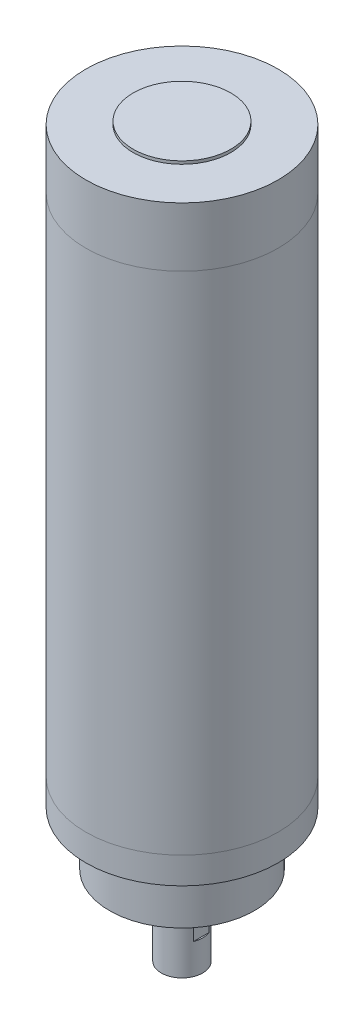
ISO-10303-21;
HEADER;
FILE_DESCRIPTION(('STEP AP214'),'2;1');
FILE_NAME('part.step','',(''),(''),'','','');
FILE_SCHEMA(('AUTOMOTIVE_DESIGN { 1 0 10303 214 1 1 1 1 }'));
ENDSEC;
DATA;
#1=APPLICATION_CONTEXT('core data for automotive mechanical design processes');
#2=APPLICATION_PROTOCOL_DEFINITION('international standard','automotive_design',2000,#1);
#3=PRODUCT_CONTEXT('',#1,'mechanical');
#4=PRODUCT('Part','Part','',(#3));
#5=PRODUCT_RELATED_PRODUCT_CATEGORY('part','',(#4));
#6=PRODUCT_DEFINITION_FORMATION('','',#4);
#7=PRODUCT_DEFINITION_CONTEXT('part definition',#1,'design');
#8=PRODUCT_DEFINITION('design','',#6,#7);
#9=PRODUCT_DEFINITION_SHAPE('','',#8);
#10=(LENGTH_UNIT() NAMED_UNIT(*) SI_UNIT(.MILLI.,.METRE.));
#11=(NAMED_UNIT(*) PLANE_ANGLE_UNIT() SI_UNIT($,.RADIAN.));
#12=(NAMED_UNIT(*) SI_UNIT($,.STERADIAN.) SOLID_ANGLE_UNIT());
#13=UNCERTAINTY_MEASURE_WITH_UNIT(LENGTH_MEASURE(1.E-05),#10,'distance_accuracy_value','');
#14=(GEOMETRIC_REPRESENTATION_CONTEXT(3) GLOBAL_UNCERTAINTY_ASSIGNED_CONTEXT((#13)) GLOBAL_UNIT_ASSIGNED_CONTEXT((#10,
#11,#12)) REPRESENTATION_CONTEXT('',''));
#15=CARTESIAN_POINT('',(0.,0.,0.));
#16=DIRECTION('',(0.,0.,1.));
#17=DIRECTION('',(1.,0.,0.));
#18=AXIS2_PLACEMENT_3D('',#15,#16,#17);
#19=CARTESIAN_POINT('',(0.,-40.5,0.));
#20=DIRECTION('',(0.,-1.,0.));
#21=DIRECTION('',(1.,0.,0.));
#22=AXIS2_PLACEMENT_3D('',#19,#20,#21);
#23=CYLINDRICAL_SURFACE('',#22,7.);
#24=CARTESIAN_POINT('',(0.,-43.7,0.));
#25=DIRECTION('',(0.,-1.,0.));
#26=DIRECTION('',(0.,0.,-1.));
#27=AXIS2_PLACEMENT_3D('',#24,#25,#26);
#28=CIRCLE('',#27,7.);
#29=CARTESIAN_POINT('',(6.50000000000001,-43.7,2.5980762113533));
#30=VERTEX_POINT('',#29);
#31=CARTESIAN_POINT('',(6.50000000000001,-43.7,-2.5980762113533));
#32=VERTEX_POINT('',#31);
#33=EDGE_CURVE('E65',#30,#32,#28,.F.);
#34=ORIENTED_EDGE('',*,*,#33,.F.);
#35=DIRECTION('',(0.,-1.,0.));
#36=VECTOR('',#35,1.);
#37=CARTESIAN_POINT('',(6.50000000000001,-40.5,2.5980762113533));
#38=LINE('',#37,#36);
#39=CARTESIAN_POINT('',(6.5,-35.5,2.5980762113533));
#40=VERTEX_POINT('',#39);
#41=EDGE_CURVE('E154',#40,#30,#38,.T.);
#42=ORIENTED_EDGE('',*,*,#41,.F.);
#43=CARTESIAN_POINT('',(0.,-35.5,0.));
#44=DIRECTION('',(0.,1.,0.));
#45=DIRECTION('',(0.,0.,1.));
#46=AXIS2_PLACEMENT_3D('',#43,#44,#45);
#47=CIRCLE('',#46,7.);
#48=CARTESIAN_POINT('',(6.5,-35.5,-2.5980762113533));
#49=VERTEX_POINT('',#48);
#50=EDGE_CURVE('E146',#49,#40,#47,.F.);
#51=ORIENTED_EDGE('',*,*,#50,.F.);
#52=DIRECTION('',(0.,-1.,0.));
#53=VECTOR('',#52,1.);
#54=CARTESIAN_POINT('',(6.50000000000001,-40.5,-2.5980762113533));
#55=LINE('',#54,#53);
#56=EDGE_CURVE('E156',#32,#49,#55,.F.);
#57=ORIENTED_EDGE('',*,*,#56,.F.);
#58=EDGE_LOOP('',(#34,#42,#51,#57));
#59=FACE_BOUND('',#58,.T.);
#60=CARTESIAN_POINT('',(0.,-32.,0.));
#61=DIRECTION('',(0.,-1.,0.));
#62=DIRECTION('',(1.,0.,0.));
#63=AXIS2_PLACEMENT_3D('',#60,#61,#62);
#64=CIRCLE('',#63,7.);
#65=CARTESIAN_POINT('',(7.,-32.,0.));
#66=VERTEX_POINT('',#65);
#67=EDGE_CURVE('E144',#66,#66,#64,.T.);
#68=ORIENTED_EDGE('',*,*,#67,.T.);
#69=EDGE_LOOP('',(#68));
#70=FACE_BOUND('',#69,.T.);
#71=CARTESIAN_POINT('',(0.,-54.,0.));
#72=DIRECTION('',(0.,-1.,0.));
#73=DIRECTION('',(1.,0.,0.));
#74=AXIS2_PLACEMENT_3D('',#71,#72,#73);
#75=CIRCLE('',#74,7.);
#76=CARTESIAN_POINT('',(7.,-54.,0.));
#77=VERTEX_POINT('',#76);
#78=EDGE_CURVE('E149',#77,#77,#75,.T.);
#79=ORIENTED_EDGE('',*,*,#78,.F.);
#80=EDGE_LOOP('',(#79));
#81=FACE_BOUND('',#80,.T.);
#82=DIRECTION('',(0.,-1.,0.));
#83=VECTOR('',#82,1.);
#84=CARTESIAN_POINT('',(-6.50000000000001,-40.5,-2.5980762113533));
#85=LINE('',#84,#83);
#86=CARTESIAN_POINT('',(-6.50000000000001,-43.7,-2.5980762113533));
#87=VERTEX_POINT('',#86);
#88=CARTESIAN_POINT('',(-6.5,-35.5,-2.5980762113533));
#89=VERTEX_POINT('',#88);
#90=EDGE_CURVE('E94',#87,#89,#85,.F.);
#91=ORIENTED_EDGE('',*,*,#90,.T.);
#92=CARTESIAN_POINT('',(0.,-35.5,0.));
#93=DIRECTION('',(0.,-1.,0.));
#94=DIRECTION('',(0.,0.,-1.));
#95=AXIS2_PLACEMENT_3D('',#92,#93,#94);
#96=CIRCLE('',#95,7.);
#97=CARTESIAN_POINT('',(-6.5,-35.5,2.5980762113533));
#98=VERTEX_POINT('',#97);
#99=EDGE_CURVE('E98',#89,#98,#96,.F.);
#100=ORIENTED_EDGE('',*,*,#99,.T.);
#101=DIRECTION('',(0.,-1.,0.));
#102=VECTOR('',#101,1.);
#103=CARTESIAN_POINT('',(-6.50000000000001,-40.5,2.5980762113533));
#104=LINE('',#103,#102);
#105=CARTESIAN_POINT('',(-6.50000000000001,-43.7,2.5980762113533));
#106=VERTEX_POINT('',#105);
#107=EDGE_CURVE('E88',#98,#106,#104,.T.);
#108=ORIENTED_EDGE('',*,*,#107,.T.);
#109=CARTESIAN_POINT('',(0.,-43.7,0.));
#110=DIRECTION('',(0.,1.,0.));
#111=DIRECTION('',(0.,0.,1.));
#112=AXIS2_PLACEMENT_3D('',#109,#110,#111);
#113=CIRCLE('',#112,7.);
#114=EDGE_CURVE('E83',#106,#87,#113,.F.);
#115=ORIENTED_EDGE('',*,*,#114,.T.);
#116=EDGE_LOOP('',(#91,#100,#108,#115));
#117=FACE_BOUND('',#116,.T.);
#118=ADVANCED_FACE('F43',(#59,#70,#81,#117),#23,.T.);
#119=CARTESIAN_POINT('',(0.,-29.5,0.));
#120=DIRECTION('',(0.,1.,0.));
#121=DIRECTION('',(-1.,0.,0.));
#122=AXIS2_PLACEMENT_3D('',#119,#120,#121);
#123=PLANE('',#122);
#124=CARTESIAN_POINT('',(0.,-29.5,0.));
#125=DIRECTION('',(0.,-1.,0.));
#126=DIRECTION('',(1.,0.,0.));
#127=AXIS2_PLACEMENT_3D('',#124,#125,#126);
#128=CIRCLE('',#127,7.5);
#129=CARTESIAN_POINT('',(7.5,-29.5,0.));
#130=VERTEX_POINT('',#129);
#131=EDGE_CURVE('E140',#130,#130,#128,.T.);
#132=ORIENTED_EDGE('',*,*,#131,.F.);
#133=EDGE_LOOP('',(#132));
#134=FACE_BOUND('',#133,.T.);
#135=ADVANCED_FACE('F117',(#134),#123,.T.);
#136=CARTESIAN_POINT('',(0.,-40.5,0.));
#137=DIRECTION('',(0.,-1.,0.));
#138=DIRECTION('',(1.,0.,0.));
#139=AXIS2_PLACEMENT_3D('',#136,#137,#138);
#140=CYLINDRICAL_SURFACE('',#139,7.5);
#141=ORIENTED_EDGE('',*,*,#131,.T.);
#142=EDGE_LOOP('',(#141));
#143=FACE_BOUND('',#142,.T.);
#144=CARTESIAN_POINT('',(0.,-32.,0.));
#145=DIRECTION('',(0.,-1.,0.));
#146=DIRECTION('',(1.,0.,0.));
#147=AXIS2_PLACEMENT_3D('',#144,#145,#146);
#148=CIRCLE('',#147,7.5);
#149=CARTESIAN_POINT('',(7.5,-32.,0.));
#150=VERTEX_POINT('',#149);
#151=EDGE_CURVE('E143',#150,#150,#148,.T.);
#152=ORIENTED_EDGE('',*,*,#151,.F.);
#153=EDGE_LOOP('',(#152));
#154=FACE_BOUND('',#153,.T.);
#155=ADVANCED_FACE('F122',(#143,#154),#140,.T.);
#156=CARTESIAN_POINT('',(7.5,-32.,0.));
#157=DIRECTION('',(0.,-1.,0.));
#158=DIRECTION('',(1.,0.,0.));
#159=AXIS2_PLACEMENT_3D('',#156,#157,#158);
#160=PLANE('',#159);
#161=ORIENTED_EDGE('',*,*,#151,.T.);
#162=EDGE_LOOP('',(#161));
#163=FACE_BOUND('',#162,.T.);
#164=ORIENTED_EDGE('',*,*,#67,.F.);
#165=EDGE_LOOP('',(#164));
#166=FACE_BOUND('',#165,.T.);
#167=ADVANCED_FACE('F129',(#163,#166),#160,.T.);
#168=CARTESIAN_POINT('',(7.,-54.,0.));
#169=DIRECTION('',(0.,-1.,0.));
#170=DIRECTION('',(1.,0.,0.));
#171=AXIS2_PLACEMENT_3D('',#168,#169,#170);
#172=PLANE('',#171);
#173=CARTESIAN_POINT('',(0.,-54.,0.));
#174=DIRECTION('',(0.,-1.,0.));
#175=DIRECTION('',(1.,0.,0.));
#176=AXIS2_PLACEMENT_3D('',#173,#174,#175);
#177=CIRCLE('',#176,6.00000000000001);
#178=CARTESIAN_POINT('',(6.00000000000002,-54.,0.));
#179=VERTEX_POINT('',#178);
#180=EDGE_CURVE('E12',#179,#179,#177,.F.);
#181=ORIENTED_EDGE('',*,*,#180,.T.);
#182=EDGE_LOOP('',(#181));
#183=FACE_BOUND('',#182,.T.);
#184=ORIENTED_EDGE('',*,*,#78,.T.);
#185=EDGE_LOOP('',(#184));
#186=FACE_BOUND('',#185,.T.);
#187=ADVANCED_FACE('F127',(#183,#186),#172,.T.);
#188=CARTESIAN_POINT('',(0.,-40.5,0.));
#189=DIRECTION('',(0.,-1.,0.));
#190=DIRECTION('',(1.,0.,0.));
#191=AXIS2_PLACEMENT_3D('',#188,#189,#190);
#192=CONICAL_SURFACE('',#191,3.60269873151781,0.139626340159539);
#193=CARTESIAN_POINT('',(0.,-53.4182387945948,0.));
#194=DIRECTION('',(0.,1.,0.));
#195=DIRECTION('',(-1.,0.,0.));
#196=AXIS2_PLACEMENT_3D('',#193,#194,#195);
#197=CIRCLE('',#196,5.41823879459489);
#198=CARTESIAN_POINT('',(-5.41823879459489,-53.4182387945948,0.));
#199=VERTEX_POINT('',#198);
#200=EDGE_CURVE('E51',#199,#199,#197,.F.);
#201=ORIENTED_EDGE('',*,*,#200,.T.);
#202=EDGE_LOOP('',(#201));
#203=FACE_BOUND('',#202,.T.);
#204=CARTESIAN_POINT('',(0.,-40.5,0.));
#205=DIRECTION('',(0.,-1.,0.));
#206=DIRECTION('',(1.,0.,0.));
#207=AXIS2_PLACEMENT_3D('',#204,#205,#206);
#208=CIRCLE('',#207,3.60269873151781);
#209=CARTESIAN_POINT('',(3.60269873151781,-40.5,0.));
#210=VERTEX_POINT('',#209);
#211=EDGE_CURVE('E167',#210,#210,#208,.T.);
#212=ORIENTED_EDGE('',*,*,#211,.F.);
#213=EDGE_LOOP('',(#212));
#214=FACE_BOUND('',#213,.T.);
#215=ADVANCED_FACE('F106',(#203,#214),#192,.F.);
#216=CARTESIAN_POINT('',(3.60269873151781,-40.5,0.));
#217=DIRECTION('',(0.,-1.,0.));
#218=DIRECTION('',(1.,0.,0.));
#219=AXIS2_PLACEMENT_3D('',#216,#217,#218);
#220=PLANE('',#219);
#221=ORIENTED_EDGE('',*,*,#211,.T.);
#222=EDGE_LOOP('',(#221));
#223=FACE_BOUND('',#222,.T.);
#224=ADVANCED_FACE('F186',(#223),#220,.T.);
#225=CARTESIAN_POINT('',(7.,-43.7,-32.5));
#226=DIRECTION('',(0.,-1.,0.));
#227=DIRECTION('',(0.,0.,-1.));
#228=AXIS2_PLACEMENT_3D('',#225,#226,#227);
#229=PLANE('',#228);
#230=DIRECTION('',(0.,0.,1.));
#231=VECTOR('',#230,1.);
#232=CARTESIAN_POINT('',(6.50000000000001,-43.7,-32.5));
#233=LINE('',#232,#231);
#234=EDGE_CURVE('E162',#32,#30,#233,.T.);
#235=ORIENTED_EDGE('',*,*,#234,.T.);
#236=ORIENTED_EDGE('',*,*,#33,.T.);
#237=EDGE_LOOP('',(#235,#236));
#238=FACE_BOUND('',#237,.T.);
#239=ADVANCED_FACE('F161',(#238),#229,.F.);
#240=CARTESIAN_POINT('',(6.5,-35.5,-32.5));
#241=DIRECTION('',(-1.,0.,0.));
#242=DIRECTION('',(0.,-1.,0.));
#243=AXIS2_PLACEMENT_3D('',#240,#241,#242);
#244=PLANE('',#243);
#245=ORIENTED_EDGE('',*,*,#56,.T.);
#246=DIRECTION('',(0.,0.,1.));
#247=VECTOR('',#246,1.);
#248=CARTESIAN_POINT('',(6.5,-35.5,-32.5));
#249=LINE('',#248,#247);
#250=EDGE_CURVE('E168',#49,#40,#249,.T.);
#251=ORIENTED_EDGE('',*,*,#250,.T.);
#252=ORIENTED_EDGE('',*,*,#41,.T.);
#253=ORIENTED_EDGE('',*,*,#234,.F.);
#254=EDGE_LOOP('',(#245,#251,#252,#253));
#255=FACE_BOUND('',#254,.T.);
#256=ADVANCED_FACE('F164',(#255),#244,.F.);
#257=CARTESIAN_POINT('',(7.,-35.5,-32.5));
#258=DIRECTION('',(0.,1.,0.));
#259=DIRECTION('',(0.,0.,1.));
#260=AXIS2_PLACEMENT_3D('',#257,#258,#259);
#261=PLANE('',#260);
#262=ORIENTED_EDGE('',*,*,#250,.F.);
#263=ORIENTED_EDGE('',*,*,#50,.T.);
#264=EDGE_LOOP('',(#262,#263));
#265=FACE_BOUND('',#264,.T.);
#266=ADVANCED_FACE('F171',(#265),#261,.F.);
#267=CARTESIAN_POINT('',(-7.,-35.5,-7.5));
#268=DIRECTION('',(0.,-1.,0.));
#269=DIRECTION('',(0.,0.,-1.));
#270=AXIS2_PLACEMENT_3D('',#267,#268,#269);
#271=PLANE('',#270);
#272=DIRECTION('',(0.,0.,1.));
#273=VECTOR('',#272,1.);
#274=CARTESIAN_POINT('',(-6.5,-35.5,-7.5));
#275=LINE('',#274,#273);
#276=EDGE_CURVE('E95',#89,#98,#275,.T.);
#277=ORIENTED_EDGE('',*,*,#276,.T.);
#278=ORIENTED_EDGE('',*,*,#99,.F.);
#279=EDGE_LOOP('',(#277,#278));
#280=FACE_BOUND('',#279,.T.);
#281=ADVANCED_FACE('F195',(#280),#271,.T.);
#282=CARTESIAN_POINT('',(-6.5,-35.5,-7.5));
#283=DIRECTION('',(-1.,0.,0.));
#284=DIRECTION('',(0.,-1.,0.));
#285=AXIS2_PLACEMENT_3D('',#282,#283,#284);
#286=PLANE('',#285);
#287=DIRECTION('',(0.,0.,1.));
#288=VECTOR('',#287,1.);
#289=CARTESIAN_POINT('',(-6.50000000000001,-43.7,-7.5));
#290=LINE('',#289,#288);
#291=EDGE_CURVE('E57',#87,#106,#290,.T.);
#292=ORIENTED_EDGE('',*,*,#291,.T.);
#293=ORIENTED_EDGE('',*,*,#107,.F.);
#294=ORIENTED_EDGE('',*,*,#276,.F.);
#295=ORIENTED_EDGE('',*,*,#90,.F.);
#296=EDGE_LOOP('',(#292,#293,#294,#295));
#297=FACE_BOUND('',#296,.T.);
#298=ADVANCED_FACE('F91',(#297),#286,.T.);
#299=CARTESIAN_POINT('',(-7.,-43.7,-7.5));
#300=DIRECTION('',(0.,1.,0.));
#301=DIRECTION('',(0.,0.,1.));
#302=AXIS2_PLACEMENT_3D('',#299,#300,#301);
#303=PLANE('',#302);
#304=ORIENTED_EDGE('',*,*,#291,.F.);
#305=ORIENTED_EDGE('',*,*,#114,.F.);
#306=EDGE_LOOP('',(#304,#305));
#307=FACE_BOUND('',#306,.T.);
#308=ADVANCED_FACE('F84',(#307),#303,.T.);
#309=CARTESIAN_POINT('',(0.,-53.4182387945948,0.));
#310=DIRECTION('',(0.,-1.,0.));
#311=DIRECTION('',(1.,0.,0.));
#312=AXIS2_PLACEMENT_3D('',#309,#310,#311);
#313=CONICAL_SURFACE('',#312,5.41823879459489,0.785398163397446);
#314=ORIENTED_EDGE('',*,*,#180,.F.);
#315=EDGE_LOOP('',(#314));
#316=FACE_BOUND('',#315,.T.);
#317=ORIENTED_EDGE('',*,*,#200,.F.);
#318=EDGE_LOOP('',(#317));
#319=FACE_BOUND('',#318,.T.);
#320=ADVANCED_FACE('F45',(#316,#319),#313,.F.);
#321=CLOSED_SHELL('',(#118,#135,#155,#167,#187,#215,#224,#239,#256,#266,#281,#298,#308,#320));
#322=MANIFOLD_SOLID_BREP('B2',#321);
#323=CARTESIAN_POINT('',(32.5,171.,0.));
#324=DIRECTION('',(0.,1.,0.));
#325=DIRECTION('',(-1.,0.,0.));
#326=AXIS2_PLACEMENT_3D('',#323,#324,#325);
#327=PLANE('',#326);
#328=CARTESIAN_POINT('',(0.,171.,0.));
#329=DIRECTION('',(0.,1.,0.));
#330=DIRECTION('',(-1.,0.,0.));
#331=AXIS2_PLACEMENT_3D('',#328,#329,#330);
#332=CIRCLE('',#331,32.5);
#333=CARTESIAN_POINT('',(-32.5,171.,0.));
#334=VERTEX_POINT('',#333);
#335=EDGE_CURVE('E304',#334,#334,#332,.T.);
#336=ORIENTED_EDGE('',*,*,#335,.F.);
#337=EDGE_LOOP('',(#336));
#338=FACE_BOUND('',#337,.T.);
#339=ADVANCED_FACE('F290',(#338),#327,.F.);
#340=CARTESIAN_POINT('',(0.,192.,0.));
#341=DIRECTION('',(0.,-1.,0.));
#342=DIRECTION('',(1.,0.,0.));
#343=AXIS2_PLACEMENT_3D('',#340,#341,#342);
#344=PLANE('',#343);
#345=CARTESIAN_POINT('',(0.,192.,0.));
#346=DIRECTION('',(0.,1.,0.));
#347=DIRECTION('',(-1.,0.,0.));
#348=AXIS2_PLACEMENT_3D('',#345,#346,#347);
#349=CIRCLE('',#348,16.5);
#350=CARTESIAN_POINT('',(-16.5000000000001,192.,0.));
#351=VERTEX_POINT('',#350);
#352=EDGE_CURVE('E42',#351,#351,#349,.T.);
#353=ORIENTED_EDGE('',*,*,#352,.T.);
#354=EDGE_LOOP('',(#353));
#355=FACE_BOUND('',#354,.T.);
#356=ADVANCED_FACE('F313',(#355),#344,.F.);
#357=CARTESIAN_POINT('',(0.,0.,0.));
#358=DIRECTION('',(0.,1.,0.));
#359=DIRECTION('',(-1.,0.,0.));
#360=AXIS2_PLACEMENT_3D('',#357,#358,#359);
#361=CYLINDRICAL_SURFACE('',#360,16.5);
#362=ORIENTED_EDGE('',*,*,#352,.F.);
#363=EDGE_LOOP('',(#362));
#364=FACE_BOUND('',#363,.T.);
#365=CARTESIAN_POINT('',(0.,191.,0.));
#366=DIRECTION('',(0.,1.,0.));
#367=DIRECTION('',(-1.,0.,0.));
#368=AXIS2_PLACEMENT_3D('',#365,#366,#367);
#369=CIRCLE('',#368,16.5);
#370=CARTESIAN_POINT('',(-16.5,191.,0.));
#371=VERTEX_POINT('',#370);
#372=EDGE_CURVE('E296',#371,#371,#369,.T.);
#373=ORIENTED_EDGE('',*,*,#372,.T.);
#374=EDGE_LOOP('',(#373));
#375=FACE_BOUND('',#374,.T.);
#376=ADVANCED_FACE('F317',(#364,#375),#361,.T.);
#377=CARTESIAN_POINT('',(16.5,191.,0.));
#378=DIRECTION('',(0.,-1.,0.));
#379=DIRECTION('',(1.,0.,0.));
#380=AXIS2_PLACEMENT_3D('',#377,#378,#379);
#381=PLANE('',#380);
#382=ORIENTED_EDGE('',*,*,#372,.F.);
#383=EDGE_LOOP('',(#382));
#384=FACE_BOUND('',#383,.T.);
#385=CARTESIAN_POINT('',(0.,191.,0.));
#386=DIRECTION('',(0.,1.,0.));
#387=DIRECTION('',(-1.,0.,0.));
#388=AXIS2_PLACEMENT_3D('',#385,#386,#387);
#389=CIRCLE('',#388,32.5);
#390=CARTESIAN_POINT('',(-32.5,191.,0.));
#391=VERTEX_POINT('',#390);
#392=EDGE_CURVE('E300',#391,#391,#389,.T.);
#393=ORIENTED_EDGE('',*,*,#392,.T.);
#394=EDGE_LOOP('',(#393));
#395=FACE_BOUND('',#394,.T.);
#396=ADVANCED_FACE('F321',(#384,#395),#381,.F.);
#397=CARTESIAN_POINT('',(0.,0.,0.));
#398=DIRECTION('',(0.,1.,0.));
#399=DIRECTION('',(-1.,0.,0.));
#400=AXIS2_PLACEMENT_3D('',#397,#398,#399);
#401=CYLINDRICAL_SURFACE('',#400,32.5);
#402=ORIENTED_EDGE('',*,*,#392,.F.);
#403=EDGE_LOOP('',(#402));
#404=FACE_BOUND('',#403,.T.);
#405=ORIENTED_EDGE('',*,*,#335,.T.);
#406=EDGE_LOOP('',(#405));
#407=FACE_BOUND('',#406,.T.);
#408=ADVANCED_FACE('F310',(#404,#407),#401,.T.);
#409=CLOSED_SHELL('',(#339,#356,#376,#396,#408));
#410=MANIFOLD_SOLID_BREP('B6',#409);
#411=CARTESIAN_POINT('',(32.5,0.,0.));
#412=DIRECTION('',(0.,-1.,0.));
#413=DIRECTION('',(1.,0.,0.));
#414=AXIS2_PLACEMENT_3D('',#411,#412,#413);
#415=PLANE('',#414);
#416=CARTESIAN_POINT('',(0.,0.,0.));
#417=DIRECTION('',(0.,1.,0.));
#418=DIRECTION('',(-1.,0.,0.));
#419=AXIS2_PLACEMENT_3D('',#416,#417,#418);
#420=CIRCLE('',#419,32.5);
#421=CARTESIAN_POINT('',(-32.5,0.,0.));
#422=VERTEX_POINT('',#421);
#423=EDGE_CURVE('E386',#422,#422,#420,.T.);
#424=ORIENTED_EDGE('',*,*,#423,.T.);
#425=EDGE_LOOP('',(#424));
#426=FACE_BOUND('',#425,.T.);
#427=ADVANCED_FACE('F367',(#426),#415,.F.);
#428=CARTESIAN_POINT('',(0.,-27.,0.));
#429=DIRECTION('',(0.,1.,0.));
#430=DIRECTION('',(-1.,0.,0.));
#431=AXIS2_PLACEMENT_3D('',#428,#429,#430);
#432=PLANE('',#431);
#433=CARTESIAN_POINT('',(0.,-27.,0.));
#434=DIRECTION('',(0.,1.,0.));
#435=DIRECTION('',(-1.,0.,0.));
#436=AXIS2_PLACEMENT_3D('',#433,#434,#435);
#437=CIRCLE('',#436,14.75);
#438=CARTESIAN_POINT('',(-14.75,-27.,0.));
#439=VERTEX_POINT('',#438);
#440=EDGE_CURVE('E289',#439,#439,#437,.F.);
#441=ORIENTED_EDGE('',*,*,#440,.F.);
#442=EDGE_LOOP('',(#441));
#443=FACE_BOUND('',#442,.T.);
#444=CARTESIAN_POINT('',(0.,-27.,0.));
#445=DIRECTION('',(0.,1.,0.));
#446=DIRECTION('',(-1.,0.,0.));
#447=AXIS2_PLACEMENT_3D('',#444,#445,#446);
#448=CIRCLE('',#447,24.5);
#449=CARTESIAN_POINT('',(-24.5,-27.,0.));
#450=VERTEX_POINT('',#449);
#451=EDGE_CURVE('E373',#450,#450,#448,.T.);
#452=ORIENTED_EDGE('',*,*,#451,.F.);
#453=EDGE_LOOP('',(#452));
#454=FACE_BOUND('',#453,.T.);
#455=ADVANCED_FACE('F408',(#443,#454),#432,.F.);
#456=CARTESIAN_POINT('',(0.,0.,0.));
#457=DIRECTION('',(0.,1.,0.));
#458=DIRECTION('',(-1.,0.,0.));
#459=AXIS2_PLACEMENT_3D('',#456,#457,#458);
#460=CYLINDRICAL_SURFACE('',#459,24.5);
#461=CARTESIAN_POINT('',(0.,-9.00000000000001,0.));
#462=DIRECTION('',(0.,1.,0.));
#463=DIRECTION('',(-1.,0.,0.));
#464=AXIS2_PLACEMENT_3D('',#461,#462,#463);
#465=CIRCLE('',#464,24.5);
#466=CARTESIAN_POINT('',(-24.5,-9.00000000000001,0.));
#467=VERTEX_POINT('',#466);
#468=EDGE_CURVE('E377',#467,#467,#465,.T.);
#469=ORIENTED_EDGE('',*,*,#468,.F.);
#470=EDGE_LOOP('',(#469));
#471=FACE_BOUND('',#470,.T.);
#472=ORIENTED_EDGE('',*,*,#451,.T.);
#473=EDGE_LOOP('',(#472));
#474=FACE_BOUND('',#473,.T.);
#475=ADVANCED_FACE('F413',(#471,#474),#460,.T.);
#476=CARTESIAN_POINT('',(24.5,-9.,0.));
#477=DIRECTION('',(0.,1.,0.));
#478=DIRECTION('',(-1.,0.,0.));
#479=AXIS2_PLACEMENT_3D('',#476,#477,#478);
#480=PLANE('',#479);
#481=CARTESIAN_POINT('',(0.,-9.00000000000001,0.));
#482=DIRECTION('',(0.,1.,0.));
#483=DIRECTION('',(-1.,0.,0.));
#484=AXIS2_PLACEMENT_3D('',#481,#482,#483);
#485=CIRCLE('',#484,32.5);
#486=CARTESIAN_POINT('',(-32.5,-9.00000000000001,0.));
#487=VERTEX_POINT('',#486);
#488=EDGE_CURVE('E381',#487,#487,#485,.T.);
#489=ORIENTED_EDGE('',*,*,#488,.F.);
#490=EDGE_LOOP('',(#489));
#491=FACE_BOUND('',#490,.T.);
#492=ORIENTED_EDGE('',*,*,#468,.T.);
#493=EDGE_LOOP('',(#492));
#494=FACE_BOUND('',#493,.T.);
#495=ADVANCED_FACE('F404',(#491,#494),#480,.F.);
#496=CARTESIAN_POINT('',(0.,0.,0.));
#497=DIRECTION('',(0.,1.,0.));
#498=DIRECTION('',(-1.,0.,0.));
#499=AXIS2_PLACEMENT_3D('',#496,#497,#498);
#500=CYLINDRICAL_SURFACE('',#499,32.5);
#501=ORIENTED_EDGE('',*,*,#423,.F.);
#502=EDGE_LOOP('',(#501));
#503=FACE_BOUND('',#502,.T.);
#504=ORIENTED_EDGE('',*,*,#488,.T.);
#505=EDGE_LOOP('',(#504));
#506=FACE_BOUND('',#505,.T.);
#507=ADVANCED_FACE('F397',(#503,#506),#500,.T.);
#508=CARTESIAN_POINT('',(0.,-29.5,0.));
#509=DIRECTION('',(0.,1.,0.));
#510=DIRECTION('',(-1.,0.,0.));
#511=AXIS2_PLACEMENT_3D('',#508,#509,#510);
#512=PLANE('',#511);
#513=CARTESIAN_POINT('',(0.,-29.5,0.));
#514=DIRECTION('',(0.,1.,0.));
#515=DIRECTION('',(-1.,0.,0.));
#516=AXIS2_PLACEMENT_3D('',#513,#514,#515);
#517=CIRCLE('',#516,14.75);
#518=CARTESIAN_POINT('',(-14.75,-29.5,0.));
#519=VERTEX_POINT('',#518);
#520=EDGE_CURVE('E389',#519,#519,#517,.T.);
#521=ORIENTED_EDGE('',*,*,#520,.F.);
#522=EDGE_LOOP('',(#521));
#523=FACE_BOUND('',#522,.T.);
#524=ADVANCED_FACE('F395',(#523),#512,.F.);
#525=CARTESIAN_POINT('',(0.,-27.,0.));
#526=DIRECTION('',(0.,1.,0.));
#527=DIRECTION('',(-1.,0.,0.));
#528=AXIS2_PLACEMENT_3D('',#525,#526,#527);
#529=CYLINDRICAL_SURFACE('',#528,14.75);
#530=ORIENTED_EDGE('',*,*,#440,.T.);
#531=EDGE_LOOP('',(#530));
#532=FACE_BOUND('',#531,.T.);
#533=ORIENTED_EDGE('',*,*,#520,.T.);
#534=EDGE_LOOP('',(#533));
#535=FACE_BOUND('',#534,.T.);
#536=ADVANCED_FACE('F393',(#532,#535),#529,.T.);
#537=CLOSED_SHELL('',(#427,#455,#475,#495,#507,#524,#536));
#538=MANIFOLD_SOLID_BREP('B37',#537);
#539=CARTESIAN_POINT('',(0.,171.,0.));
#540=DIRECTION('',(0.,-1.,0.));
#541=DIRECTION('',(0.,0.,-1.));
#542=AXIS2_PLACEMENT_3D('',#539,#540,#541);
#543=CYLINDRICAL_SURFACE('',#542,32.5);
#544=CARTESIAN_POINT('',(0.,171.,0.));
#545=DIRECTION('',(0.,1.,0.));
#546=DIRECTION('',(0.,0.,1.));
#547=AXIS2_PLACEMENT_3D('',#544,#545,#546);
#548=CIRCLE('',#547,32.5);
#549=CARTESIAN_POINT('',(0.,171.,32.5));
#550=VERTEX_POINT('',#549);
#551=EDGE_CURVE('E366',#550,#550,#548,.T.);
#552=ORIENTED_EDGE('',*,*,#551,.F.);
#553=EDGE_LOOP('',(#552));
#554=FACE_BOUND('',#553,.T.);
#555=CARTESIAN_POINT('',(0.,0.,0.));
#556=DIRECTION('',(0.,1.,0.));
#557=DIRECTION('',(0.,0.,1.));
#558=AXIS2_PLACEMENT_3D('',#555,#556,#557);
#559=CIRCLE('',#558,32.5);
#560=CARTESIAN_POINT('',(0.,0.,32.5));
#561=VERTEX_POINT('',#560);
#562=EDGE_CURVE('E470',#561,#561,#559,.T.);
#563=ORIENTED_EDGE('',*,*,#562,.T.);
#564=EDGE_LOOP('',(#563));
#565=FACE_BOUND('',#564,.T.);
#566=ADVANCED_FACE('F467',(#554,#565),#543,.T.);
#567=CARTESIAN_POINT('',(0.,171.,0.));
#568=DIRECTION('',(0.,1.,0.));
#569=DIRECTION('',(0.,0.,1.));
#570=AXIS2_PLACEMENT_3D('',#567,#568,#569);
#571=PLANE('',#570);
#572=ORIENTED_EDGE('',*,*,#551,.T.);
#573=EDGE_LOOP('',(#572));
#574=FACE_BOUND('',#573,.T.);
#575=ADVANCED_FACE('F482',(#574),#571,.T.);
#576=CARTESIAN_POINT('',(0.,0.,0.));
#577=DIRECTION('',(0.,1.,0.));
#578=DIRECTION('',(0.,0.,1.));
#579=AXIS2_PLACEMENT_3D('',#576,#577,#578);
#580=PLANE('',#579);
#581=ORIENTED_EDGE('',*,*,#562,.F.);
#582=EDGE_LOOP('',(#581));
#583=FACE_BOUND('',#582,.T.);
#584=ADVANCED_FACE('F480',(#583),#580,.F.);
#585=CLOSED_SHELL('',(#566,#575,#584));
#586=MANIFOLD_SOLID_BREP('B284',#585);
#587=ADVANCED_BREP_SHAPE_REPRESENTATION('',(#18,#322,#410,#538,#586),#14);
#588=SHAPE_DEFINITION_REPRESENTATION(#9,#587);
ENDSEC;
END-ISO-10303-21;
